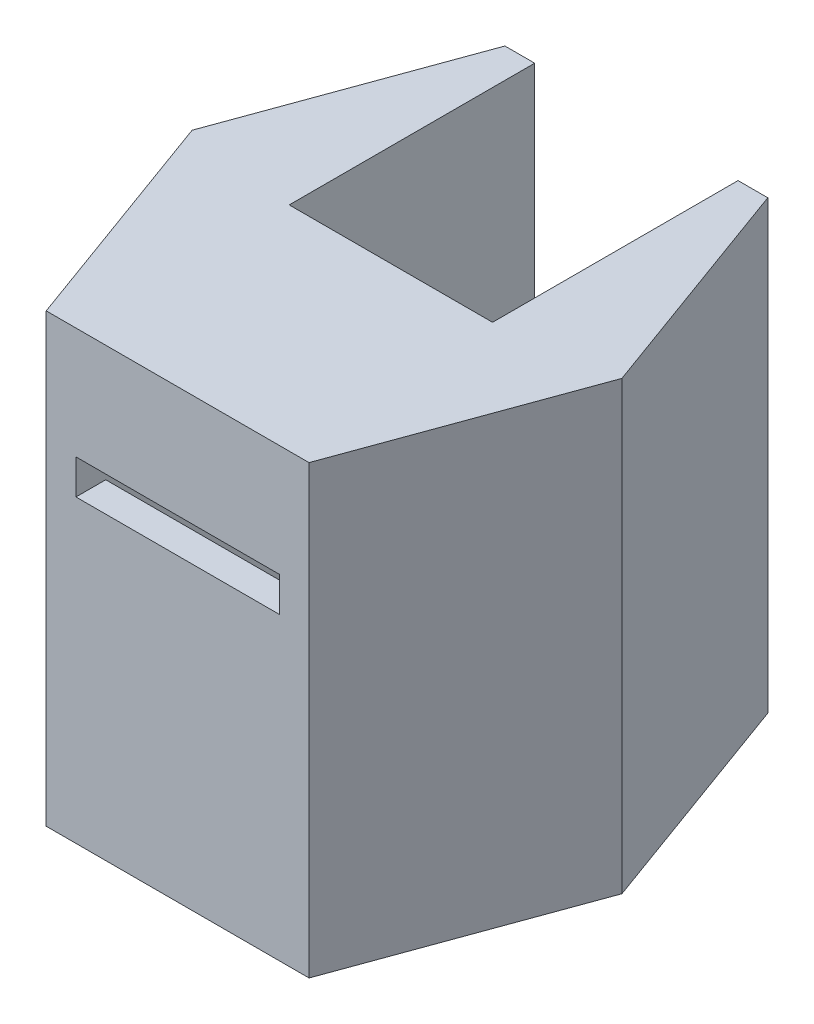
ISO-10303-21;
HEADER;
FILE_DESCRIPTION(('STEP AP214'),'2;1');
FILE_NAME('part.step','',(''),(''),'','','');
FILE_SCHEMA(('AUTOMOTIVE_DESIGN { 1 0 10303 214 1 1 1 1 }'));
ENDSEC;
DATA;
#1=APPLICATION_CONTEXT('core data for automotive mechanical design processes');
#2=APPLICATION_PROTOCOL_DEFINITION('international standard','automotive_design',2000,#1);
#3=PRODUCT_CONTEXT('',#1,'mechanical');
#4=PRODUCT('Part','Part','',(#3));
#5=PRODUCT_RELATED_PRODUCT_CATEGORY('part','',(#4));
#6=PRODUCT_DEFINITION_FORMATION('','',#4);
#7=PRODUCT_DEFINITION_CONTEXT('part definition',#1,'design');
#8=PRODUCT_DEFINITION('design','',#6,#7);
#9=PRODUCT_DEFINITION_SHAPE('','',#8);
#10=(LENGTH_UNIT() NAMED_UNIT(*) SI_UNIT(.MILLI.,.METRE.));
#11=(NAMED_UNIT(*) PLANE_ANGLE_UNIT() SI_UNIT($,.RADIAN.));
#12=(NAMED_UNIT(*) SI_UNIT($,.STERADIAN.) SOLID_ANGLE_UNIT());
#13=UNCERTAINTY_MEASURE_WITH_UNIT(LENGTH_MEASURE(1.E-05),#10,'distance_accuracy_value','');
#14=(GEOMETRIC_REPRESENTATION_CONTEXT(3) GLOBAL_UNCERTAINTY_ASSIGNED_CONTEXT((#13)) GLOBAL_UNIT_ASSIGNED_CONTEXT((#10,
#11,#12)) REPRESENTATION_CONTEXT('',''));
#15=CARTESIAN_POINT('',(0.,0.,0.));
#16=DIRECTION('',(0.,0.,1.));
#17=DIRECTION('',(1.,0.,0.));
#18=AXIS2_PLACEMENT_3D('',#15,#16,#17);
#19=CARTESIAN_POINT('',(23.5,45.,-3.));
#20=DIRECTION('',(1.,0.,0.));
#21=DIRECTION('',(0.,0.,-1.));
#22=AXIS2_PLACEMENT_3D('',#19,#20,#21);
#23=PLANE('',#22);
#24=DIRECTION('',(0.,0.,1.));
#25=VECTOR('',#24,1.);
#26=CARTESIAN_POINT('',(23.5,3.,-66.9683493551006));
#27=LINE('',#26,#25);
#28=CARTESIAN_POINT('',(23.5,3.00000000000001,-46.25));
#29=VERTEX_POINT('',#28);
#30=CARTESIAN_POINT('',(23.5,3.00000000000001,-3.));
#31=VERTEX_POINT('',#30);
#32=EDGE_CURVE('E59',#29,#31,#27,.T.);
#33=ORIENTED_EDGE('',*,*,#32,.T.);
#34=DIRECTION('',(0.,-1.,0.));
#35=VECTOR('',#34,1.);
#36=CARTESIAN_POINT('',(23.5,45.,-3.));
#37=LINE('',#36,#35);
#38=CARTESIAN_POINT('',(23.5,30.25,-3.));
#39=VERTEX_POINT('',#38);
#40=EDGE_CURVE('E170',#39,#31,#37,.T.);
#41=ORIENTED_EDGE('',*,*,#40,.F.);
#42=DIRECTION('',(0.,0.,-1.));
#43=VECTOR('',#42,1.);
#44=CARTESIAN_POINT('',(23.5,30.25,17.));
#45=LINE('',#44,#43);
#46=CARTESIAN_POINT('',(23.5,30.25,0.));
#47=VERTEX_POINT('',#46);
#48=EDGE_CURVE('E158',#47,#39,#45,.T.);
#49=ORIENTED_EDGE('',*,*,#48,.F.);
#50=DIRECTION('',(0.,-1.,0.));
#51=VECTOR('',#50,1.);
#52=CARTESIAN_POINT('',(23.5,45.,0.));
#53=LINE('',#52,#51);
#54=CARTESIAN_POINT('',(23.5,33.75,0.));
#55=VERTEX_POINT('',#54);
#56=EDGE_CURVE('E11',#55,#47,#53,.T.);
#57=ORIENTED_EDGE('',*,*,#56,.F.);
#58=DIRECTION('',(0.,0.,-1.));
#59=VECTOR('',#58,1.);
#60=CARTESIAN_POINT('',(23.5,33.75,17.));
#61=LINE('',#60,#59);
#62=CARTESIAN_POINT('',(23.5,33.75,-3.));
#63=VERTEX_POINT('',#62);
#64=EDGE_CURVE('E223',#55,#63,#61,.T.);
#65=ORIENTED_EDGE('',*,*,#64,.T.);
#66=CARTESIAN_POINT('',(23.5,43.,-3.));
#67=VERTEX_POINT('',#66);
#68=EDGE_CURVE('E176',#67,#63,#37,.T.);
#69=ORIENTED_EDGE('',*,*,#68,.F.);
#70=DIRECTION('',(0.,0.,1.));
#71=VECTOR('',#70,1.);
#72=CARTESIAN_POINT('',(23.5,43.,-21.5));
#73=LINE('',#72,#71);
#74=CARTESIAN_POINT('',(23.5,43.,-21.5));
#75=VERTEX_POINT('',#74);
#76=EDGE_CURVE('E255',#75,#67,#73,.T.);
#77=ORIENTED_EDGE('',*,*,#76,.F.);
#78=DIRECTION('',(0.,-1.,0.));
#79=VECTOR('',#78,1.);
#80=CARTESIAN_POINT('',(23.5,43.,-21.5));
#81=LINE('',#80,#79);
#82=CARTESIAN_POINT('',(23.5,45.,-21.5));
#83=VERTEX_POINT('',#82);
#84=EDGE_CURVE('E237',#83,#75,#81,.T.);
#85=ORIENTED_EDGE('',*,*,#84,.F.);
#86=DIRECTION('',(0.,0.,1.));
#87=VECTOR('',#86,1.);
#88=CARTESIAN_POINT('',(23.5,45.,-3.));
#89=LINE('',#88,#87);
#90=CARTESIAN_POINT('',(23.5,45.,-46.25));
#91=VERTEX_POINT('',#90);
#92=EDGE_CURVE('E276',#91,#83,#89,.T.);
#93=ORIENTED_EDGE('',*,*,#92,.F.);
#94=DIRECTION('',(0.,-1.,0.));
#95=VECTOR('',#94,1.);
#96=CARTESIAN_POINT('',(23.5,45.,-46.25));
#97=LINE('',#96,#95);
#98=EDGE_CURVE('E182',#91,#29,#97,.T.);
#99=ORIENTED_EDGE('',*,*,#98,.T.);
#100=EDGE_LOOP('',(#33,#41,#49,#57,#65,#69,#77,#85,#93,#99));
#101=FACE_BOUND('',#100,.T.);
#102=ADVANCED_FACE('F43',(#101),#23,.F.);
#103=CARTESIAN_POINT('',(3.00000000000001,45.,-3.));
#104=DIRECTION('',(0.,0.,1.));
#105=DIRECTION('',(1.,0.,0.));
#106=AXIS2_PLACEMENT_3D('',#103,#104,#105);
#107=PLANE('',#106);
#108=DIRECTION('',(1.,0.,0.));
#109=VECTOR('',#108,1.);
#110=CARTESIAN_POINT('',(23.5,3.,-3.));
#111=LINE('',#110,#109);
#112=CARTESIAN_POINT('',(3.00000000000001,3.00000000000001,-3.));
#113=VERTEX_POINT('',#112);
#114=EDGE_CURVE('E66',#113,#31,#111,.T.);
#115=ORIENTED_EDGE('',*,*,#114,.F.);
#116=DIRECTION('',(0.,-1.,0.));
#117=VECTOR('',#116,1.);
#118=CARTESIAN_POINT('',(3.00000000000001,45.,-3.));
#119=LINE('',#118,#117);
#120=CARTESIAN_POINT('',(3.00000000000001,30.25,-3.));
#121=VERTEX_POINT('',#120);
#122=EDGE_CURVE('E171',#121,#113,#119,.T.);
#123=ORIENTED_EDGE('',*,*,#122,.F.);
#124=DIRECTION('',(-1.,0.,0.));
#125=VECTOR('',#124,1.);
#126=CARTESIAN_POINT('',(2.99999999999999,30.25,-3.));
#127=LINE('',#126,#125);
#128=EDGE_CURVE('E161',#39,#121,#127,.T.);
#129=ORIENTED_EDGE('',*,*,#128,.F.);
#130=ORIENTED_EDGE('',*,*,#40,.T.);
#131=EDGE_LOOP('',(#115,#123,#129,#130));
#132=FACE_BOUND('',#131,.T.);
#133=ADVANCED_FACE('F169',(#132),#107,.F.);
#134=CARTESIAN_POINT('',(3.,45.,-46.25));
#135=DIRECTION('',(-1.,0.,0.));
#136=DIRECTION('',(0.,0.,1.));
#137=AXIS2_PLACEMENT_3D('',#134,#135,#136);
#138=PLANE('',#137);
#139=DIRECTION('',(0.,0.,1.));
#140=VECTOR('',#139,1.);
#141=CARTESIAN_POINT('',(3.00000000000001,3.,-66.9683493551006));
#142=LINE('',#141,#140);
#143=CARTESIAN_POINT('',(3.,3.00000000000001,-46.25));
#144=VERTEX_POINT('',#143);
#145=EDGE_CURVE('E324',#144,#113,#142,.T.);
#146=ORIENTED_EDGE('',*,*,#145,.F.);
#147=DIRECTION('',(0.,-1.,0.));
#148=VECTOR('',#147,1.);
#149=CARTESIAN_POINT('',(3.,45.,-46.25));
#150=LINE('',#149,#148);
#151=CARTESIAN_POINT('',(3.,45.,-46.25));
#152=VERTEX_POINT('',#151);
#153=EDGE_CURVE('E314',#152,#144,#150,.T.);
#154=ORIENTED_EDGE('',*,*,#153,.F.);
#155=DIRECTION('',(0.,0.,-1.));
#156=VECTOR('',#155,1.);
#157=CARTESIAN_POINT('',(3.,45.,-46.25));
#158=LINE('',#157,#156);
#159=CARTESIAN_POINT('',(3.00000000000001,45.,-21.5));
#160=VERTEX_POINT('',#159);
#161=EDGE_CURVE('E280',#160,#152,#158,.T.);
#162=ORIENTED_EDGE('',*,*,#161,.F.);
#163=DIRECTION('',(0.,1.,0.));
#164=VECTOR('',#163,1.);
#165=CARTESIAN_POINT('',(3.00000000000001,45.,-21.5));
#166=LINE('',#165,#164);
#167=CARTESIAN_POINT('',(3.,43.,-21.5));
#168=VERTEX_POINT('',#167);
#169=EDGE_CURVE('E244',#168,#160,#166,.T.);
#170=ORIENTED_EDGE('',*,*,#169,.F.);
#171=DIRECTION('',(0.,0.,1.));
#172=VECTOR('',#171,1.);
#173=CARTESIAN_POINT('',(3.,43.,-21.5));
#174=LINE('',#173,#172);
#175=CARTESIAN_POINT('',(2.99999999999999,43.,-3.));
#176=VERTEX_POINT('',#175);
#177=EDGE_CURVE('E250',#168,#176,#174,.T.);
#178=ORIENTED_EDGE('',*,*,#177,.T.);
#179=CARTESIAN_POINT('',(2.99999999999999,33.75,-3.));
#180=VERTEX_POINT('',#179);
#181=EDGE_CURVE('E177',#176,#180,#119,.T.);
#182=ORIENTED_EDGE('',*,*,#181,.T.);
#183=DIRECTION('',(0.,0.,-1.));
#184=VECTOR('',#183,1.);
#185=CARTESIAN_POINT('',(2.99999999999999,33.75,17.));
#186=LINE('',#185,#184);
#187=CARTESIAN_POINT('',(2.99999999999999,33.75,0.));
#188=VERTEX_POINT('',#187);
#189=EDGE_CURVE('E221',#188,#180,#186,.T.);
#190=ORIENTED_EDGE('',*,*,#189,.F.);
#191=DIRECTION('',(0.,1.,0.));
#192=VECTOR('',#191,1.);
#193=CARTESIAN_POINT('',(2.99999999999999,45.,0.));
#194=LINE('',#193,#192);
#195=CARTESIAN_POINT('',(2.99999999999999,30.25,0.));
#196=VERTEX_POINT('',#195);
#197=EDGE_CURVE('E207',#196,#188,#194,.T.);
#198=ORIENTED_EDGE('',*,*,#197,.F.);
#199=DIRECTION('',(0.,0.,-1.));
#200=VECTOR('',#199,1.);
#201=CARTESIAN_POINT('',(2.99999999999999,30.25,17.));
#202=LINE('',#201,#200);
#203=EDGE_CURVE('E166',#196,#121,#202,.T.);
#204=ORIENTED_EDGE('',*,*,#203,.T.);
#205=ORIENTED_EDGE('',*,*,#122,.T.);
#206=EDGE_LOOP('',(#146,#154,#162,#170,#178,#182,#190,#198,#204,#205));
#207=FACE_BOUND('',#206,.T.);
#208=ADVANCED_FACE('F225',(#207),#138,.F.);
#209=ORIENTED_EDGE('',*,*,#68,.T.);
#210=DIRECTION('',(1.,0.,0.));
#211=VECTOR('',#210,1.);
#212=CARTESIAN_POINT('',(23.5,33.75,-3.));
#213=LINE('',#212,#211);
#214=EDGE_CURVE('E167',#180,#63,#213,.T.);
#215=ORIENTED_EDGE('',*,*,#214,.F.);
#216=ORIENTED_EDGE('',*,*,#181,.F.);
#217=DIRECTION('',(-1.,0.,0.));
#218=VECTOR('',#217,1.);
#219=CARTESIAN_POINT('',(2.99999999999999,43.,-3.));
#220=LINE('',#219,#218);
#221=EDGE_CURVE('E232',#67,#176,#220,.T.);
#222=ORIENTED_EDGE('',*,*,#221,.F.);
#223=EDGE_LOOP('',(#209,#215,#216,#222));
#224=FACE_BOUND('',#223,.T.);
#225=ADVANCED_FACE('F338',(#224),#107,.F.);
#226=CARTESIAN_POINT('',(-8.41681166740595,45.,-23.125));
#227=DIRECTION('',(0.939692620785908,0.,-0.342020143325669));
#228=DIRECTION('',(-0.34202014332567,0.,-0.939692620785908));
#229=AXIS2_PLACEMENT_3D('',#226,#227,#228);
#230=PLANE('',#229);
#231=DIRECTION('',(0.34202014332567,0.,0.939692620785908));
#232=VECTOR('',#231,1.);
#233=CARTESIAN_POINT('',(-8.41681166740595,0.,-23.125));
#234=LINE('',#233,#232);
#235=CARTESIAN_POINT('',(-8.41681166740595,0.,-23.125));
#236=VERTEX_POINT('',#235);
#237=CARTESIAN_POINT('',(0.,0.,0.));
#238=VERTEX_POINT('',#237);
#239=EDGE_CURVE('E258',#236,#238,#234,.T.);
#240=ORIENTED_EDGE('',*,*,#239,.T.);
#241=DIRECTION('',(0.,-1.,0.));
#242=VECTOR('',#241,1.);
#243=CARTESIAN_POINT('',(0.,45.,0.));
#244=LINE('',#243,#242);
#245=CARTESIAN_POINT('',(0.,45.,0.));
#246=VERTEX_POINT('',#245);
#247=EDGE_CURVE('E201',#246,#238,#244,.T.);
#248=ORIENTED_EDGE('',*,*,#247,.F.);
#249=DIRECTION('',(0.34202014332567,0.,0.939692620785908));
#250=VECTOR('',#249,1.);
#251=CARTESIAN_POINT('',(-8.41681166740595,45.,-23.125));
#252=LINE('',#251,#250);
#253=CARTESIAN_POINT('',(-8.41681166740595,45.,-23.125));
#254=VERTEX_POINT('',#253);
#255=EDGE_CURVE('E259',#254,#246,#252,.T.);
#256=ORIENTED_EDGE('',*,*,#255,.F.);
#257=DIRECTION('',(0.,-1.,0.));
#258=VECTOR('',#257,1.);
#259=CARTESIAN_POINT('',(-8.41681166740595,45.,-23.125));
#260=LINE('',#259,#258);
#261=EDGE_CURVE('E289',#254,#236,#260,.T.);
#262=ORIENTED_EDGE('',*,*,#261,.T.);
#263=EDGE_LOOP('',(#240,#248,#256,#262));
#264=FACE_BOUND('',#263,.T.);
#265=ADVANCED_FACE('F45',(#264),#230,.F.);
#266=CARTESIAN_POINT('',(0.,45.,0.));
#267=DIRECTION('',(0.,0.,-1.));
#268=DIRECTION('',(-1.,0.,0.));
#269=AXIS2_PLACEMENT_3D('',#266,#267,#268);
#270=PLANE('',#269);
#271=DIRECTION('',(1.,0.,0.));
#272=VECTOR('',#271,1.);
#273=CARTESIAN_POINT('',(0.,33.75,0.));
#274=LINE('',#273,#272);
#275=EDGE_CURVE('E52',#188,#55,#274,.T.);
#276=ORIENTED_EDGE('',*,*,#275,.T.);
#277=ORIENTED_EDGE('',*,*,#56,.T.);
#278=DIRECTION('',(-1.,0.,0.));
#279=VECTOR('',#278,1.);
#280=CARTESIAN_POINT('',(0.,30.25,0.));
#281=LINE('',#280,#279);
#282=EDGE_CURVE('E164',#47,#196,#281,.T.);
#283=ORIENTED_EDGE('',*,*,#282,.T.);
#284=ORIENTED_EDGE('',*,*,#197,.T.);
#285=EDGE_LOOP('',(#276,#277,#283,#284));
#286=FACE_BOUND('',#285,.T.);
#287=DIRECTION('',(1.,0.,0.));
#288=VECTOR('',#287,1.);
#289=CARTESIAN_POINT('',(0.,0.,0.));
#290=LINE('',#289,#288);
#291=CARTESIAN_POINT('',(26.5,0.,0.));
#292=VERTEX_POINT('',#291);
#293=EDGE_CURVE('E293',#238,#292,#290,.T.);
#294=ORIENTED_EDGE('',*,*,#293,.T.);
#295=DIRECTION('',(0.,-1.,0.));
#296=VECTOR('',#295,1.);
#297=CARTESIAN_POINT('',(26.5,45.,0.));
#298=LINE('',#297,#296);
#299=CARTESIAN_POINT('',(26.5,45.,0.));
#300=VERTEX_POINT('',#299);
#301=EDGE_CURVE('E197',#300,#292,#298,.T.);
#302=ORIENTED_EDGE('',*,*,#301,.F.);
#303=DIRECTION('',(1.,0.,0.));
#304=VECTOR('',#303,1.);
#305=CARTESIAN_POINT('',(0.,45.,0.));
#306=LINE('',#305,#304);
#307=EDGE_CURVE('E263',#246,#300,#306,.T.);
#308=ORIENTED_EDGE('',*,*,#307,.F.);
#309=ORIENTED_EDGE('',*,*,#247,.T.);
#310=EDGE_LOOP('',(#294,#302,#308,#309));
#311=FACE_BOUND('',#310,.T.);
#312=ADVANCED_FACE('F213',(#286,#311),#270,.F.);
#313=CARTESIAN_POINT('',(26.5,45.,0.));
#314=DIRECTION('',(-0.939692620785908,0.,-0.34202014332567));
#315=DIRECTION('',(-0.34202014332567,0.,0.939692620785908));
#316=AXIS2_PLACEMENT_3D('',#313,#314,#315);
#317=PLANE('',#316);
#318=DIRECTION('',(0.34202014332567,0.,-0.939692620785908));
#319=VECTOR('',#318,1.);
#320=CARTESIAN_POINT('',(26.5,0.,0.));
#321=LINE('',#320,#319);
#322=CARTESIAN_POINT('',(34.916811667406,0.,-23.125));
#323=VERTEX_POINT('',#322);
#324=EDGE_CURVE('E296',#292,#323,#321,.T.);
#325=ORIENTED_EDGE('',*,*,#324,.T.);
#326=DIRECTION('',(0.,-1.,0.));
#327=VECTOR('',#326,1.);
#328=CARTESIAN_POINT('',(34.916811667406,45.,-23.125));
#329=LINE('',#328,#327);
#330=CARTESIAN_POINT('',(34.916811667406,45.,-23.125));
#331=VERTEX_POINT('',#330);
#332=EDGE_CURVE('E193',#331,#323,#329,.T.);
#333=ORIENTED_EDGE('',*,*,#332,.F.);
#334=DIRECTION('',(0.34202014332567,0.,-0.939692620785908));
#335=VECTOR('',#334,1.);
#336=CARTESIAN_POINT('',(26.5,45.,0.));
#337=LINE('',#336,#335);
#338=EDGE_CURVE('E267',#300,#331,#337,.T.);
#339=ORIENTED_EDGE('',*,*,#338,.F.);
#340=ORIENTED_EDGE('',*,*,#301,.T.);
#341=EDGE_LOOP('',(#325,#333,#339,#340));
#342=FACE_BOUND('',#341,.T.);
#343=ADVANCED_FACE('F369',(#342),#317,.F.);
#344=CARTESIAN_POINT('',(34.916811667406,45.,-23.125));
#345=DIRECTION('',(-0.939692620785908,0.,0.34202014332567));
#346=DIRECTION('',(0.34202014332567,0.,0.939692620785908));
#347=AXIS2_PLACEMENT_3D('',#344,#345,#346);
#348=PLANE('',#347);
#349=DIRECTION('',(-0.34202014332567,0.,-0.939692620785908));
#350=VECTOR('',#349,1.);
#351=CARTESIAN_POINT('',(34.916811667406,0.,-23.125));
#352=LINE('',#351,#350);
#353=CARTESIAN_POINT('',(26.5,0.,-46.25));
#354=VERTEX_POINT('',#353);
#355=EDGE_CURVE('E299',#323,#354,#352,.T.);
#356=ORIENTED_EDGE('',*,*,#355,.T.);
#357=DIRECTION('',(0.,-1.,0.));
#358=VECTOR('',#357,1.);
#359=CARTESIAN_POINT('',(26.5,45.,-46.25));
#360=LINE('',#359,#358);
#361=CARTESIAN_POINT('',(26.5,45.,-46.25));
#362=VERTEX_POINT('',#361);
#363=EDGE_CURVE('E189',#362,#354,#360,.T.);
#364=ORIENTED_EDGE('',*,*,#363,.F.);
#365=DIRECTION('',(-0.34202014332567,0.,-0.939692620785908));
#366=VECTOR('',#365,1.);
#367=CARTESIAN_POINT('',(34.916811667406,45.,-23.125));
#368=LINE('',#367,#366);
#369=EDGE_CURVE('E270',#331,#362,#368,.T.);
#370=ORIENTED_EDGE('',*,*,#369,.F.);
#371=ORIENTED_EDGE('',*,*,#332,.T.);
#372=EDGE_LOOP('',(#356,#364,#370,#371));
#373=FACE_BOUND('',#372,.T.);
#374=ADVANCED_FACE('F373',(#373),#348,.F.);
#375=CARTESIAN_POINT('',(0.,45.,-46.25));
#376=DIRECTION('',(0.,0.,1.));
#377=DIRECTION('',(1.,0.,0.));
#378=AXIS2_PLACEMENT_3D('',#375,#376,#377);
#379=PLANE('',#378);
#380=DIRECTION('',(-1.,0.,0.));
#381=VECTOR('',#380,1.);
#382=CARTESIAN_POINT('',(0.,0.,-46.25));
#383=LINE('',#382,#381);
#384=CARTESIAN_POINT('',(0.,0.,-46.25));
#385=VERTEX_POINT('',#384);
#386=EDGE_CURVE('E303',#354,#385,#383,.T.);
#387=ORIENTED_EDGE('',*,*,#386,.T.);
#388=DIRECTION('',(0.,-1.,0.));
#389=VECTOR('',#388,1.);
#390=CARTESIAN_POINT('',(0.,45.,-46.25));
#391=LINE('',#390,#389);
#392=CARTESIAN_POINT('',(0.,45.,-46.25));
#393=VERTEX_POINT('',#392);
#394=EDGE_CURVE('E311',#393,#385,#391,.T.);
#395=ORIENTED_EDGE('',*,*,#394,.F.);
#396=DIRECTION('',(-1.,0.,0.));
#397=VECTOR('',#396,1.);
#398=CARTESIAN_POINT('',(0.,45.,-46.25));
#399=LINE('',#398,#397);
#400=EDGE_CURVE('E283',#152,#393,#399,.T.);
#401=ORIENTED_EDGE('',*,*,#400,.F.);
#402=ORIENTED_EDGE('',*,*,#153,.T.);
#403=DIRECTION('',(-1.,0.,0.));
#404=VECTOR('',#403,1.);
#405=CARTESIAN_POINT('',(23.5,3.,-46.25));
#406=LINE('',#405,#404);
#407=EDGE_CURVE('E173',#29,#144,#406,.T.);
#408=ORIENTED_EDGE('',*,*,#407,.F.);
#409=ORIENTED_EDGE('',*,*,#98,.F.);
#410=DIRECTION('',(-1.,0.,0.));
#411=VECTOR('',#410,1.);
#412=CARTESIAN_POINT('',(23.5,45.,-46.25));
#413=LINE('',#412,#411);
#414=EDGE_CURVE('E273',#362,#91,#413,.T.);
#415=ORIENTED_EDGE('',*,*,#414,.F.);
#416=ORIENTED_EDGE('',*,*,#363,.T.);
#417=EDGE_LOOP('',(#387,#395,#401,#402,#408,#409,#415,#416));
#418=FACE_BOUND('',#417,.T.);
#419=ADVANCED_FACE('F353',(#418),#379,.F.);
#420=CARTESIAN_POINT('',(0.,45.,-46.25));
#421=DIRECTION('',(0.939692620785908,0.,0.342020143325669));
#422=DIRECTION('',(0.34202014332567,0.,-0.939692620785908));
#423=AXIS2_PLACEMENT_3D('',#420,#421,#422);
#424=PLANE('',#423);
#425=DIRECTION('',(-0.342020143325669,0.,0.939692620785908));
#426=VECTOR('',#425,1.);
#427=CARTESIAN_POINT('',(0.,0.,-46.25));
#428=LINE('',#427,#426);
#429=EDGE_CURVE('E264',#385,#236,#428,.T.);
#430=ORIENTED_EDGE('',*,*,#429,.T.);
#431=ORIENTED_EDGE('',*,*,#261,.F.);
#432=DIRECTION('',(-0.342020143325669,0.,0.939692620785908));
#433=VECTOR('',#432,1.);
#434=CARTESIAN_POINT('',(0.,45.,-46.25));
#435=LINE('',#434,#433);
#436=EDGE_CURVE('E286',#393,#254,#435,.T.);
#437=ORIENTED_EDGE('',*,*,#436,.F.);
#438=ORIENTED_EDGE('',*,*,#394,.T.);
#439=EDGE_LOOP('',(#430,#431,#437,#438));
#440=FACE_BOUND('',#439,.T.);
#441=ADVANCED_FACE('F359',(#440),#424,.F.);
#442=CARTESIAN_POINT('',(0.,45.,0.));
#443=DIRECTION('',(0.,1.,0.));
#444=DIRECTION('',(0.,0.,1.));
#445=AXIS2_PLACEMENT_3D('',#442,#443,#444);
#446=PLANE('',#445);
#447=DIRECTION('',(1.,0.,0.));
#448=VECTOR('',#447,1.);
#449=CARTESIAN_POINT('',(23.5,45.,-21.5));
#450=LINE('',#449,#448);
#451=EDGE_CURVE('E247',#160,#83,#450,.T.);
#452=ORIENTED_EDGE('',*,*,#451,.F.);
#453=ORIENTED_EDGE('',*,*,#161,.T.);
#454=ORIENTED_EDGE('',*,*,#400,.T.);
#455=ORIENTED_EDGE('',*,*,#436,.T.);
#456=ORIENTED_EDGE('',*,*,#255,.T.);
#457=ORIENTED_EDGE('',*,*,#307,.T.);
#458=ORIENTED_EDGE('',*,*,#338,.T.);
#459=ORIENTED_EDGE('',*,*,#369,.T.);
#460=ORIENTED_EDGE('',*,*,#414,.T.);
#461=ORIENTED_EDGE('',*,*,#92,.T.);
#462=EDGE_LOOP('',(#452,#453,#454,#455,#456,#457,#458,#459,#460,#461));
#463=FACE_BOUND('',#462,.T.);
#464=ADVANCED_FACE('F351',(#463),#446,.T.);
#465=CARTESIAN_POINT('',(0.,0.,0.));
#466=DIRECTION('',(0.,1.,0.));
#467=DIRECTION('',(0.,0.,1.));
#468=AXIS2_PLACEMENT_3D('',#465,#466,#467);
#469=PLANE('',#468);
#470=ORIENTED_EDGE('',*,*,#239,.F.);
#471=ORIENTED_EDGE('',*,*,#429,.F.);
#472=ORIENTED_EDGE('',*,*,#386,.F.);
#473=ORIENTED_EDGE('',*,*,#355,.F.);
#474=ORIENTED_EDGE('',*,*,#324,.F.);
#475=ORIENTED_EDGE('',*,*,#293,.F.);
#476=EDGE_LOOP('',(#470,#471,#472,#473,#474,#475));
#477=FACE_BOUND('',#476,.T.);
#478=ADVANCED_FACE('F377',(#477),#469,.F.);
#479=CARTESIAN_POINT('',(3.,43.,-21.5));
#480=DIRECTION('',(0.,1.,0.));
#481=DIRECTION('',(0.,0.,1.));
#482=AXIS2_PLACEMENT_3D('',#479,#480,#481);
#483=PLANE('',#482);
#484=ORIENTED_EDGE('',*,*,#221,.T.);
#485=ORIENTED_EDGE('',*,*,#177,.F.);
#486=DIRECTION('',(-1.,0.,0.));
#487=VECTOR('',#486,1.);
#488=CARTESIAN_POINT('',(3.,43.,-21.5));
#489=LINE('',#488,#487);
#490=EDGE_CURVE('E241',#75,#168,#489,.T.);
#491=ORIENTED_EDGE('',*,*,#490,.F.);
#492=ORIENTED_EDGE('',*,*,#76,.T.);
#493=EDGE_LOOP('',(#484,#485,#491,#492));
#494=FACE_BOUND('',#493,.T.);
#495=ADVANCED_FACE('F343',(#494),#483,.F.);
#496=CARTESIAN_POINT('',(0.,0.,-21.5));
#497=DIRECTION('',(0.,0.,1.));
#498=DIRECTION('',(1.,0.,0.));
#499=AXIS2_PLACEMENT_3D('',#496,#497,#498);
#500=PLANE('',#499);
#501=ORIENTED_EDGE('',*,*,#84,.T.);
#502=ORIENTED_EDGE('',*,*,#490,.T.);
#503=ORIENTED_EDGE('',*,*,#169,.T.);
#504=ORIENTED_EDGE('',*,*,#451,.T.);
#505=EDGE_LOOP('',(#501,#502,#503,#504));
#506=FACE_BOUND('',#505,.T.);
#507=ADVANCED_FACE('F347',(#506),#500,.F.);
#508=CARTESIAN_POINT('',(23.5,33.75,17.));
#509=DIRECTION('',(0.,1.,0.));
#510=DIRECTION('',(-1.,0.,0.));
#511=AXIS2_PLACEMENT_3D('',#508,#509,#510);
#512=PLANE('',#511);
#513=ORIENTED_EDGE('',*,*,#189,.T.);
#514=ORIENTED_EDGE('',*,*,#214,.T.);
#515=ORIENTED_EDGE('',*,*,#64,.F.);
#516=ORIENTED_EDGE('',*,*,#275,.F.);
#517=EDGE_LOOP('',(#513,#514,#515,#516));
#518=FACE_BOUND('',#517,.T.);
#519=ADVANCED_FACE('F219',(#518),#512,.F.);
#520=CARTESIAN_POINT('',(2.99999999999999,30.25,17.));
#521=DIRECTION('',(0.,-1.,0.));
#522=DIRECTION('',(1.,0.,0.));
#523=AXIS2_PLACEMENT_3D('',#520,#521,#522);
#524=PLANE('',#523);
#525=ORIENTED_EDGE('',*,*,#48,.T.);
#526=ORIENTED_EDGE('',*,*,#128,.T.);
#527=ORIENTED_EDGE('',*,*,#203,.F.);
#528=ORIENTED_EDGE('',*,*,#282,.F.);
#529=EDGE_LOOP('',(#525,#526,#527,#528));
#530=FACE_BOUND('',#529,.T.);
#531=ADVANCED_FACE('F160',(#530),#524,.F.);
#532=CARTESIAN_POINT('',(23.5,3.,-66.9683493551006));
#533=DIRECTION('',(0.,-1.,0.));
#534=DIRECTION('',(1.,0.,0.));
#535=AXIS2_PLACEMENT_3D('',#532,#533,#534);
#536=PLANE('',#535);
#537=ORIENTED_EDGE('',*,*,#32,.F.);
#538=ORIENTED_EDGE('',*,*,#407,.T.);
#539=ORIENTED_EDGE('',*,*,#145,.T.);
#540=ORIENTED_EDGE('',*,*,#114,.T.);
#541=EDGE_LOOP('',(#537,#538,#539,#540));
#542=FACE_BOUND('',#541,.T.);
#543=ADVANCED_FACE('F326',(#542),#536,.F.);
#544=CLOSED_SHELL('',(#102,#133,#208,#225,#265,#312,#343,#374,#419,#441,#464,#478,#495,#507,
#519,#531,#543));
#545=MANIFOLD_SOLID_BREP('B2',#544);
#546=ADVANCED_BREP_SHAPE_REPRESENTATION('',(#18,#545),#14);
#547=SHAPE_DEFINITION_REPRESENTATION(#9,#546);
ENDSEC;
END-ISO-10303-21;
